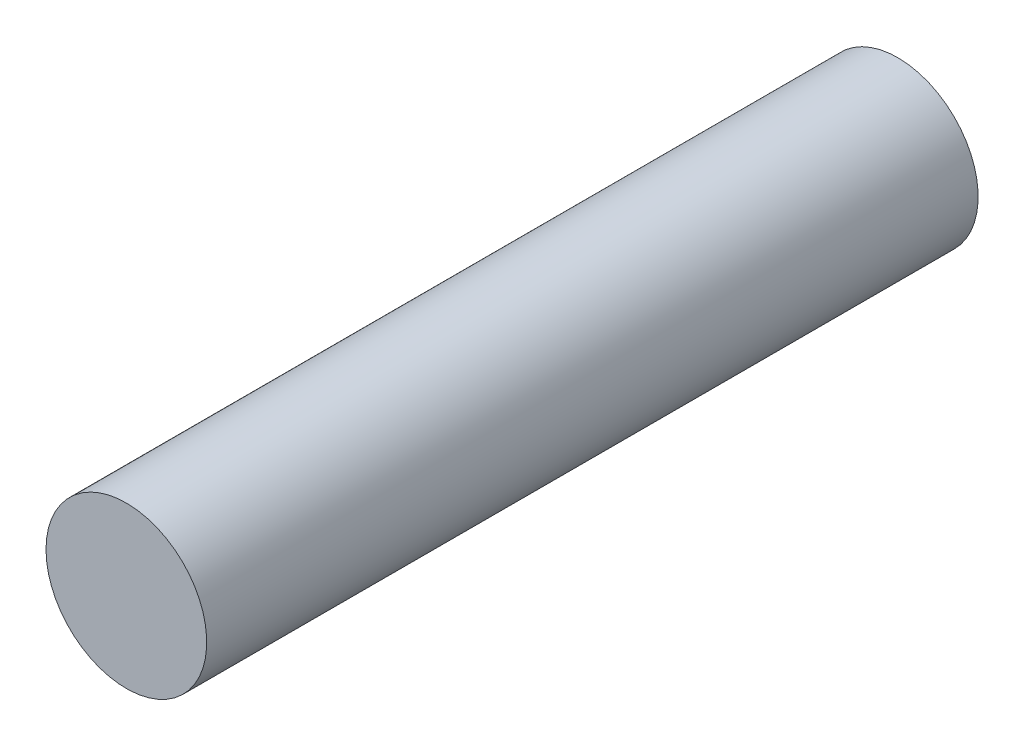
ISO-10303-21;
HEADER;
FILE_DESCRIPTION(('STEP AP214'),'2;1');
FILE_NAME('part.step','',(''),(''),'','','');
FILE_SCHEMA(('AUTOMOTIVE_DESIGN { 1 0 10303 214 1 1 1 1 }'));
ENDSEC;
DATA;
#1=APPLICATION_CONTEXT('core data for automotive mechanical design processes');
#2=APPLICATION_PROTOCOL_DEFINITION('international standard','automotive_design',2000,#1);
#3=PRODUCT_CONTEXT('',#1,'mechanical');
#4=PRODUCT('Part','Part','',(#3));
#5=PRODUCT_RELATED_PRODUCT_CATEGORY('part','',(#4));
#6=PRODUCT_DEFINITION_FORMATION('','',#4);
#7=PRODUCT_DEFINITION_CONTEXT('part definition',#1,'design');
#8=PRODUCT_DEFINITION('design','',#6,#7);
#9=PRODUCT_DEFINITION_SHAPE('','',#8);
#10=(LENGTH_UNIT() NAMED_UNIT(*) SI_UNIT(.MILLI.,.METRE.));
#11=(NAMED_UNIT(*) PLANE_ANGLE_UNIT() SI_UNIT($,.RADIAN.));
#12=(NAMED_UNIT(*) SI_UNIT($,.STERADIAN.) SOLID_ANGLE_UNIT());
#13=UNCERTAINTY_MEASURE_WITH_UNIT(LENGTH_MEASURE(1.E-05),#10,'distance_accuracy_value','');
#14=(GEOMETRIC_REPRESENTATION_CONTEXT(3) GLOBAL_UNCERTAINTY_ASSIGNED_CONTEXT((#13)) GLOBAL_UNIT_ASSIGNED_CONTEXT((#10,
#11,#12)) REPRESENTATION_CONTEXT('',''));
#15=CARTESIAN_POINT('',(0.,0.,0.));
#16=DIRECTION('',(0.,0.,1.));
#17=DIRECTION('',(1.,0.,0.));
#18=AXIS2_PLACEMENT_3D('',#15,#16,#17);
#19=CARTESIAN_POINT('',(0.,0.,76.2));
#20=DIRECTION('',(0.,0.,-1.));
#21=DIRECTION('',(-1.,0.,0.));
#22=AXIS2_PLACEMENT_3D('',#19,#20,#21);
#23=CYLINDRICAL_SURFACE('',#22,15.875);
#24=CARTESIAN_POINT('',(0.,0.,76.2));
#25=DIRECTION('',(0.,0.,1.));
#26=DIRECTION('',(1.,0.,0.));
#27=AXIS2_PLACEMENT_3D('',#24,#25,#26);
#28=CIRCLE('',#27,15.875);
#29=CARTESIAN_POINT('',(-15.875,0.,76.2));
#30=VERTEX_POINT('',#29);
#31=EDGE_CURVE('E10',#30,#30,#28,.T.);
#32=CARTESIAN_POINT('',(0.,0.,-76.2));
#33=DIRECTION('',(0.,0.,1.));
#34=DIRECTION('',(1.,0.,0.));
#35=AXIS2_PLACEMENT_3D('',#32,#33,#34);
#36=CIRCLE('',#35,15.875);
#37=CARTESIAN_POINT('',(-15.875,0.,-76.2));
#38=VERTEX_POINT('',#37);
#39=EDGE_CURVE('E36',#38,#38,#36,.T.);
#40=CARTESIAN_POINT('',(-15.875,0.,76.2));
#41=CARTESIAN_POINT('',(-15.875,0.,74.6125));
#42=CARTESIAN_POINT('',(-15.875,0.,73.025));
#43=CARTESIAN_POINT('',(-15.875,0.,69.85));
#44=CARTESIAN_POINT('',(-15.875,0.,68.2625));
#45=CARTESIAN_POINT('',(-15.875,0.,65.0875));
#46=CARTESIAN_POINT('',(-15.875,0.,63.5));
#47=CARTESIAN_POINT('',(-15.875,0.,60.325));
#48=CARTESIAN_POINT('',(-15.875,0.,58.7375));
#49=CARTESIAN_POINT('',(-15.875,0.,55.5625));
#50=CARTESIAN_POINT('',(-15.875,0.,53.975));
#51=CARTESIAN_POINT('',(-15.875,0.,50.8));
#52=CARTESIAN_POINT('',(-15.875,0.,49.2125));
#53=CARTESIAN_POINT('',(-15.875,0.,46.0375));
#54=CARTESIAN_POINT('',(-15.875,0.,44.45));
#55=CARTESIAN_POINT('',(-15.875,0.,41.275));
#56=CARTESIAN_POINT('',(-15.875,0.,39.6875));
#57=CARTESIAN_POINT('',(-15.875,0.,36.5125));
#58=CARTESIAN_POINT('',(-15.875,0.,34.925));
#59=CARTESIAN_POINT('',(-15.875,0.,31.75));
#60=CARTESIAN_POINT('',(-15.875,0.,30.1625));
#61=CARTESIAN_POINT('',(-15.875,0.,26.9875));
#62=CARTESIAN_POINT('',(-15.875,0.,25.4));
#63=CARTESIAN_POINT('',(-15.875,0.,22.225));
#64=CARTESIAN_POINT('',(-15.875,0.,20.6375));
#65=CARTESIAN_POINT('',(-15.875,0.,17.4625));
#66=CARTESIAN_POINT('',(-15.875,0.,15.875));
#67=CARTESIAN_POINT('',(-15.875,0.,12.7));
#68=CARTESIAN_POINT('',(-15.875,0.,11.1125));
#69=CARTESIAN_POINT('',(-15.875,0.,7.93749999999999));
#70=CARTESIAN_POINT('',(-15.875,0.,6.34999999999999));
#71=CARTESIAN_POINT('',(-15.875,0.,3.17499999999999));
#72=CARTESIAN_POINT('',(-15.875,0.,1.58749999999999));
#73=CARTESIAN_POINT('',(-15.875,0.,-1.58750000000001));
#74=CARTESIAN_POINT('',(-15.875,0.,-3.17500000000002));
#75=CARTESIAN_POINT('',(-15.875,0.,-6.35000000000002));
#76=CARTESIAN_POINT('',(-15.875,0.,-7.93750000000002));
#77=CARTESIAN_POINT('',(-15.875,0.,-11.1125));
#78=CARTESIAN_POINT('',(-15.875,0.,-12.7));
#79=CARTESIAN_POINT('',(-15.875,0.,-15.875));
#80=CARTESIAN_POINT('',(-15.875,0.,-17.4625));
#81=CARTESIAN_POINT('',(-15.875,0.,-20.6375));
#82=CARTESIAN_POINT('',(-15.875,0.,-22.225));
#83=CARTESIAN_POINT('',(-15.875,0.,-25.4));
#84=CARTESIAN_POINT('',(-15.875,0.,-26.9875));
#85=CARTESIAN_POINT('',(-15.875,0.,-30.1625));
#86=CARTESIAN_POINT('',(-15.875,0.,-31.75));
#87=CARTESIAN_POINT('',(-15.875,0.,-34.925));
#88=CARTESIAN_POINT('',(-15.875,0.,-36.5125));
#89=CARTESIAN_POINT('',(-15.875,0.,-39.6875));
#90=CARTESIAN_POINT('',(-15.875,0.,-41.275));
#91=CARTESIAN_POINT('',(-15.875,0.,-44.45));
#92=CARTESIAN_POINT('',(-15.875,0.,-46.0375));
#93=CARTESIAN_POINT('',(-15.875,0.,-49.2125));
#94=CARTESIAN_POINT('',(-15.875,0.,-50.8));
#95=CARTESIAN_POINT('',(-15.875,0.,-53.975));
#96=CARTESIAN_POINT('',(-15.875,0.,-55.5625));
#97=CARTESIAN_POINT('',(-15.875,0.,-58.7375));
#98=CARTESIAN_POINT('',(-15.875,0.,-60.325));
#99=CARTESIAN_POINT('',(-15.875,0.,-63.5));
#100=CARTESIAN_POINT('',(-15.875,0.,-65.0875));
#101=CARTESIAN_POINT('',(-15.875,0.,-68.2625));
#102=CARTESIAN_POINT('',(-15.875,0.,-69.85));
#103=CARTESIAN_POINT('',(-15.875,0.,-73.025));
#104=CARTESIAN_POINT('',(-15.875,0.,-74.6125));
#105=CARTESIAN_POINT('',(-15.875,0.,-76.2));
#106=B_SPLINE_CURVE_WITH_KNOTS('',3,(#40,#41,#42,#43,#44,#45,#46,#47,#48,#49,#50,#51,#52,#53,
#54,#55,#56,#57,#58,#59,#60,#61,#62,#63,#64,#65,#66,#67,#68,#69,#70,#71,#72,#73,#74,#75,#76,#77,
#78,#79,#80,#81,#82,#83,#84,#85,#86,#87,#88,#89,#90,#91,#92,#93,#94,#95,#96,#97,#98,#99,#100,
#101,#102,#103,#104,#105),.UNSPECIFIED.,.F.,.F.,(4,2,2,2,2,2,2,2,2,2,2,2,2,2,2,2,2,2,2,2,2,2,2,
2,2,2,2,2,2,2,2,2,4),(0.,4.76249999999999,9.52499999999999,14.2875,19.05,23.8125,28.575,33.3375,
38.1,42.8625,47.625,52.3875,57.15,61.9125,66.675,71.4375,76.2,80.9625,85.725,90.4875,95.25,
100.0125,104.775,109.5375,114.3,119.0625,123.825,128.5875,133.35,138.1125,142.875,147.6375,
152.4),.UNSPECIFIED.);
#107=EDGE_CURVE('BSEAM30',#30,#38,#106,.T.);
#108=ORIENTED_EDGE('',*,*,#31,.F.);
#109=ORIENTED_EDGE('',*,*,#39,.T.);
#110=ORIENTED_EDGE('',*,*,#107,.T.);
#111=ORIENTED_EDGE('',*,*,#107,.F.);
#112=EDGE_LOOP('',(#108,#110,#109,#111));
#113=FACE_BOUND('',#112,.T.);
#114=ADVANCED_FACE('F30',(#113),#23,.T.);
#115=CARTESIAN_POINT('',(0.,0.,76.2));
#116=DIRECTION('',(0.,0.,1.));
#117=DIRECTION('',(1.,0.,0.));
#118=AXIS2_PLACEMENT_3D('',#115,#116,#117);
#119=PLANE('',#118);
#120=ORIENTED_EDGE('',*,*,#31,.T.);
#121=EDGE_LOOP('',(#120));
#122=FACE_BOUND('',#121,.T.);
#123=ADVANCED_FACE('F45',(#122),#119,.T.);
#124=CARTESIAN_POINT('',(0.,0.,-76.2));
#125=DIRECTION('',(0.,0.,1.));
#126=DIRECTION('',(1.,0.,0.));
#127=AXIS2_PLACEMENT_3D('',#124,#125,#126);
#128=PLANE('',#127);
#129=ORIENTED_EDGE('',*,*,#39,.F.);
#130=EDGE_LOOP('',(#129));
#131=FACE_BOUND('',#130,.T.);
#132=ADVANCED_FACE('F43',(#131),#128,.F.);
#133=CLOSED_SHELL('',(#114,#123,#132));
#134=MANIFOLD_SOLID_BREP('B2',#133);
#135=ADVANCED_BREP_SHAPE_REPRESENTATION('',(#18,#134),#14);
#136=SHAPE_DEFINITION_REPRESENTATION(#9,#135);
ENDSEC;
END-ISO-10303-21;
